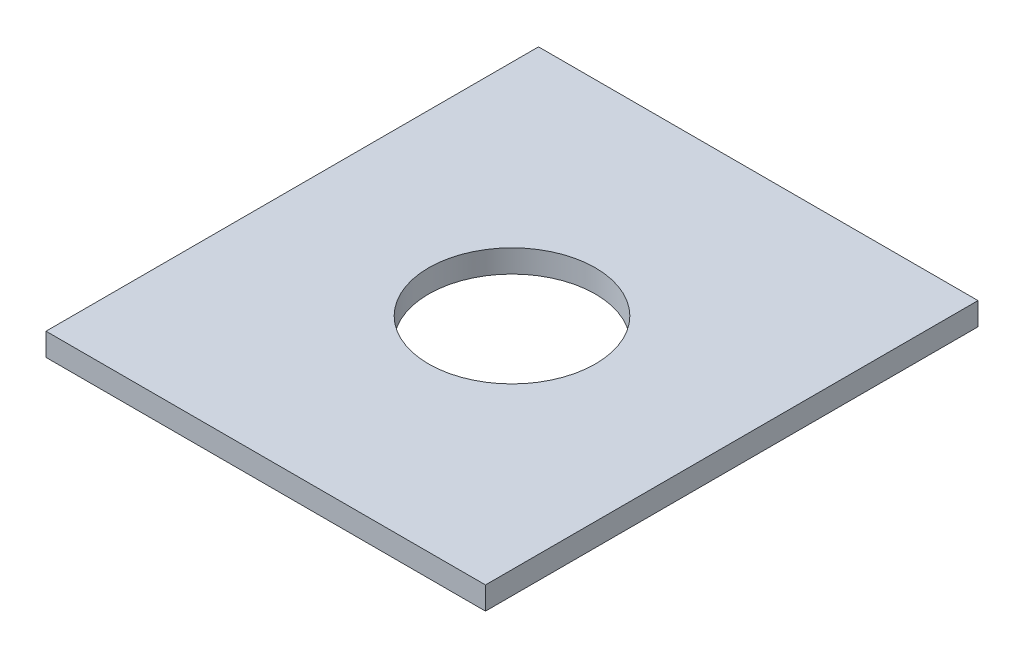
ISO-10303-21;
HEADER;
FILE_DESCRIPTION(('STEP AP214'),'2;1');
FILE_NAME('part.step','',(''),(''),'','','');
FILE_SCHEMA(('AUTOMOTIVE_DESIGN { 1 0 10303 214 1 1 1 1 }'));
ENDSEC;
DATA;
#1=APPLICATION_CONTEXT('core data for automotive mechanical design processes');
#2=APPLICATION_PROTOCOL_DEFINITION('international standard','automotive_design',2000,#1);
#3=PRODUCT_CONTEXT('',#1,'mechanical');
#4=PRODUCT('Part','Part','',(#3));
#5=PRODUCT_RELATED_PRODUCT_CATEGORY('part','',(#4));
#6=PRODUCT_DEFINITION_FORMATION('','',#4);
#7=PRODUCT_DEFINITION_CONTEXT('part definition',#1,'design');
#8=PRODUCT_DEFINITION('design','',#6,#7);
#9=PRODUCT_DEFINITION_SHAPE('','',#8);
#10=(LENGTH_UNIT() NAMED_UNIT(*) SI_UNIT(.MILLI.,.METRE.));
#11=(NAMED_UNIT(*) PLANE_ANGLE_UNIT() SI_UNIT($,.RADIAN.));
#12=(NAMED_UNIT(*) SI_UNIT($,.STERADIAN.) SOLID_ANGLE_UNIT());
#13=UNCERTAINTY_MEASURE_WITH_UNIT(LENGTH_MEASURE(1.E-05),#10,'distance_accuracy_value','');
#14=(GEOMETRIC_REPRESENTATION_CONTEXT(3) GLOBAL_UNCERTAINTY_ASSIGNED_CONTEXT((#13)) GLOBAL_UNIT_ASSIGNED_CONTEXT((#10,
#11,#12)) REPRESENTATION_CONTEXT('',''));
#15=CARTESIAN_POINT('',(0.,0.,0.));
#16=DIRECTION('',(0.,0.,1.));
#17=DIRECTION('',(1.,0.,0.));
#18=AXIS2_PLACEMENT_3D('',#15,#16,#17);
#19=CARTESIAN_POINT('',(0.,3.,0.));
#20=DIRECTION('',(0.,1.,0.));
#21=DIRECTION('',(0.,0.,1.));
#22=AXIS2_PLACEMENT_3D('',#19,#20,#21);
#23=PLANE('',#22);
#24=DIRECTION('',(0.,0.,1.));
#25=VECTOR('',#24,1.);
#26=CARTESIAN_POINT('',(-29.0000000000714,3.,-32.5000000849449));
#27=LINE('',#26,#25);
#28=CARTESIAN_POINT('',(-29.0000000000714,3.,-32.5000000849449));
#29=VERTEX_POINT('',#28);
#30=CARTESIAN_POINT('',(-29.0000000000714,3.,32.4999999150554));
#31=VERTEX_POINT('',#30);
#32=EDGE_CURVE('E93',#29,#31,#27,.T.);
#33=ORIENTED_EDGE('',*,*,#32,.T.);
#34=DIRECTION('',(1.,0.,0.));
#35=VECTOR('',#34,1.);
#36=CARTESIAN_POINT('',(-29.0000000000714,3.,32.4999999150554));
#37=LINE('',#36,#35);
#38=CARTESIAN_POINT('',(28.9999999999287,3.,32.4999999150554));
#39=VERTEX_POINT('',#38);
#40=EDGE_CURVE('E88',#31,#39,#37,.T.);
#41=ORIENTED_EDGE('',*,*,#40,.T.);
#42=DIRECTION('',(0.,0.,-1.));
#43=VECTOR('',#42,1.);
#44=CARTESIAN_POINT('',(28.9999999999287,3.,32.4999999150554));
#45=LINE('',#44,#43);
#46=CARTESIAN_POINT('',(28.9999999999287,3.,-32.5000000849449));
#47=VERTEX_POINT('',#46);
#48=EDGE_CURVE('E91',#39,#47,#45,.T.);
#49=ORIENTED_EDGE('',*,*,#48,.T.);
#50=DIRECTION('',(-1.,0.,0.));
#51=VECTOR('',#50,1.);
#52=CARTESIAN_POINT('',(28.9999999999287,3.,-32.5000000849449));
#53=LINE('',#52,#51);
#54=EDGE_CURVE('E58',#47,#29,#53,.T.);
#55=ORIENTED_EDGE('',*,*,#54,.T.);
#56=EDGE_LOOP('',(#33,#41,#49,#55));
#57=FACE_BOUND('',#56,.T.);
#58=CARTESIAN_POINT('',(0.,3.,0.));
#59=DIRECTION('',(0.,1.,0.));
#60=DIRECTION('',(0.,0.,1.));
#61=AXIS2_PLACEMENT_3D('',#58,#59,#60);
#62=CIRCLE('',#61,11.);
#63=CARTESIAN_POINT('',(0.,3.,11.));
#64=VERTEX_POINT('',#63);
#65=EDGE_CURVE('E108',#64,#64,#62,.T.);
#66=ORIENTED_EDGE('',*,*,#65,.F.);
#67=EDGE_LOOP('',(#66));
#68=FACE_BOUND('',#67,.T.);
#69=ADVANCED_FACE('F41',(#57,#68),#23,.T.);
#70=CARTESIAN_POINT('',(0.,0.,0.));
#71=DIRECTION('',(0.,1.,0.));
#72=DIRECTION('',(0.,0.,1.));
#73=AXIS2_PLACEMENT_3D('',#70,#71,#72);
#74=PLANE('',#73);
#75=DIRECTION('',(0.,0.,1.));
#76=VECTOR('',#75,1.);
#77=CARTESIAN_POINT('',(-29.0000000000714,0.,-32.5000000849449));
#78=LINE('',#77,#76);
#79=CARTESIAN_POINT('',(-29.0000000000714,0.,-32.5000000849449));
#80=VERTEX_POINT('',#79);
#81=CARTESIAN_POINT('',(-29.0000000000714,0.,32.4999999150554));
#82=VERTEX_POINT('',#81);
#83=EDGE_CURVE('E105',#80,#82,#78,.T.);
#84=ORIENTED_EDGE('',*,*,#83,.F.);
#85=DIRECTION('',(-1.,0.,0.));
#86=VECTOR('',#85,1.);
#87=CARTESIAN_POINT('',(28.9999999999287,0.,-32.5000000849449));
#88=LINE('',#87,#86);
#89=CARTESIAN_POINT('',(28.9999999999287,0.,-32.5000000849449));
#90=VERTEX_POINT('',#89);
#91=EDGE_CURVE('E81',#90,#80,#88,.T.);
#92=ORIENTED_EDGE('',*,*,#91,.F.);
#93=DIRECTION('',(0.,0.,-1.));
#94=VECTOR('',#93,1.);
#95=CARTESIAN_POINT('',(28.9999999999287,0.,32.4999999150554));
#96=LINE('',#95,#94);
#97=CARTESIAN_POINT('',(28.9999999999287,0.,32.4999999150554));
#98=VERTEX_POINT('',#97);
#99=EDGE_CURVE('E75',#98,#90,#96,.T.);
#100=ORIENTED_EDGE('',*,*,#99,.F.);
#101=DIRECTION('',(1.,0.,0.));
#102=VECTOR('',#101,1.);
#103=CARTESIAN_POINT('',(-29.0000000000714,0.,32.4999999150554));
#104=LINE('',#103,#102);
#105=EDGE_CURVE('E97',#82,#98,#104,.T.);
#106=ORIENTED_EDGE('',*,*,#105,.F.);
#107=EDGE_LOOP('',(#84,#92,#100,#106));
#108=FACE_BOUND('',#107,.T.);
#109=CARTESIAN_POINT('',(0.,0.,0.));
#110=DIRECTION('',(0.,1.,0.));
#111=DIRECTION('',(0.,0.,1.));
#112=AXIS2_PLACEMENT_3D('',#109,#110,#111);
#113=CIRCLE('',#112,11.);
#114=CARTESIAN_POINT('',(0.,0.,11.));
#115=VERTEX_POINT('',#114);
#116=EDGE_CURVE('E120',#115,#115,#113,.T.);
#117=ORIENTED_EDGE('',*,*,#116,.T.);
#118=EDGE_LOOP('',(#117));
#119=FACE_BOUND('',#118,.T.);
#120=ADVANCED_FACE('F116',(#108,#119),#74,.F.);
#121=CARTESIAN_POINT('',(-29.0000000000714,3.,-32.5000000849449));
#122=DIRECTION('',(1.,0.,0.));
#123=DIRECTION('',(0.,0.,-1.));
#124=AXIS2_PLACEMENT_3D('',#121,#122,#123);
#125=PLANE('',#124);
#126=ORIENTED_EDGE('',*,*,#83,.T.);
#127=DIRECTION('',(0.,-1.,0.));
#128=VECTOR('',#127,1.);
#129=CARTESIAN_POINT('',(-29.0000000000714,3.,32.4999999150554));
#130=LINE('',#129,#128);
#131=EDGE_CURVE('E11',#31,#82,#130,.T.);
#132=ORIENTED_EDGE('',*,*,#131,.F.);
#133=ORIENTED_EDGE('',*,*,#32,.F.);
#134=DIRECTION('',(0.,-1.,0.));
#135=VECTOR('',#134,1.);
#136=CARTESIAN_POINT('',(-29.0000000000714,3.,-32.5000000849449));
#137=LINE('',#136,#135);
#138=EDGE_CURVE('E101',#29,#80,#137,.T.);
#139=ORIENTED_EDGE('',*,*,#138,.T.);
#140=EDGE_LOOP('',(#126,#132,#133,#139));
#141=FACE_BOUND('',#140,.T.);
#142=ADVANCED_FACE('F43',(#141),#125,.F.);
#143=CARTESIAN_POINT('',(-29.0000000000714,3.,32.4999999150554));
#144=DIRECTION('',(0.,0.,-1.));
#145=DIRECTION('',(-1.,0.,0.));
#146=AXIS2_PLACEMENT_3D('',#143,#144,#145);
#147=PLANE('',#146);
#148=ORIENTED_EDGE('',*,*,#105,.T.);
#149=DIRECTION('',(0.,-1.,0.));
#150=VECTOR('',#149,1.);
#151=CARTESIAN_POINT('',(28.9999999999287,3.,32.4999999150554));
#152=LINE('',#151,#150);
#153=EDGE_CURVE('E50',#39,#98,#152,.T.);
#154=ORIENTED_EDGE('',*,*,#153,.F.);
#155=ORIENTED_EDGE('',*,*,#40,.F.);
#156=ORIENTED_EDGE('',*,*,#131,.T.);
#157=EDGE_LOOP('',(#148,#154,#155,#156));
#158=FACE_BOUND('',#157,.T.);
#159=ADVANCED_FACE('F96',(#158),#147,.F.);
#160=CARTESIAN_POINT('',(28.9999999999287,3.,32.4999999150554));
#161=DIRECTION('',(-1.,0.,0.));
#162=DIRECTION('',(0.,0.,1.));
#163=AXIS2_PLACEMENT_3D('',#160,#161,#162);
#164=PLANE('',#163);
#165=ORIENTED_EDGE('',*,*,#99,.T.);
#166=DIRECTION('',(0.,-1.,0.));
#167=VECTOR('',#166,1.);
#168=CARTESIAN_POINT('',(28.9999999999287,3.,-32.5000000849449));
#169=LINE('',#168,#167);
#170=EDGE_CURVE('E98',#47,#90,#169,.T.);
#171=ORIENTED_EDGE('',*,*,#170,.F.);
#172=ORIENTED_EDGE('',*,*,#48,.F.);
#173=ORIENTED_EDGE('',*,*,#153,.T.);
#174=EDGE_LOOP('',(#165,#171,#172,#173));
#175=FACE_BOUND('',#174,.T.);
#176=ADVANCED_FACE('F99',(#175),#164,.F.);
#177=CARTESIAN_POINT('',(28.9999999999287,3.,-32.5000000849449));
#178=DIRECTION('',(0.,0.,1.));
#179=DIRECTION('',(1.,0.,0.));
#180=AXIS2_PLACEMENT_3D('',#177,#178,#179);
#181=PLANE('',#180);
#182=ORIENTED_EDGE('',*,*,#91,.T.);
#183=ORIENTED_EDGE('',*,*,#138,.F.);
#184=ORIENTED_EDGE('',*,*,#54,.F.);
#185=ORIENTED_EDGE('',*,*,#170,.T.);
#186=EDGE_LOOP('',(#182,#183,#184,#185));
#187=FACE_BOUND('',#186,.T.);
#188=ADVANCED_FACE('F113',(#187),#181,.F.);
#189=CARTESIAN_POINT('',(0.,3.,0.));
#190=DIRECTION('',(0.,-1.,0.));
#191=DIRECTION('',(0.,0.,-1.));
#192=AXIS2_PLACEMENT_3D('',#189,#190,#191);
#193=CYLINDRICAL_SURFACE('',#192,11.);
#194=ORIENTED_EDGE('',*,*,#65,.T.);
#195=EDGE_LOOP('',(#194));
#196=FACE_BOUND('',#195,.T.);
#197=ORIENTED_EDGE('',*,*,#116,.F.);
#198=EDGE_LOOP('',(#197));
#199=FACE_BOUND('',#198,.T.);
#200=ADVANCED_FACE('F126',(#196,#199),#193,.F.);
#201=CLOSED_SHELL('',(#69,#120,#142,#159,#176,#188,#200));
#202=MANIFOLD_SOLID_BREP('B2',#201);
#203=ADVANCED_BREP_SHAPE_REPRESENTATION('',(#18,#202),#14);
#204=SHAPE_DEFINITION_REPRESENTATION(#9,#203);
ENDSEC;
END-ISO-10303-21;
